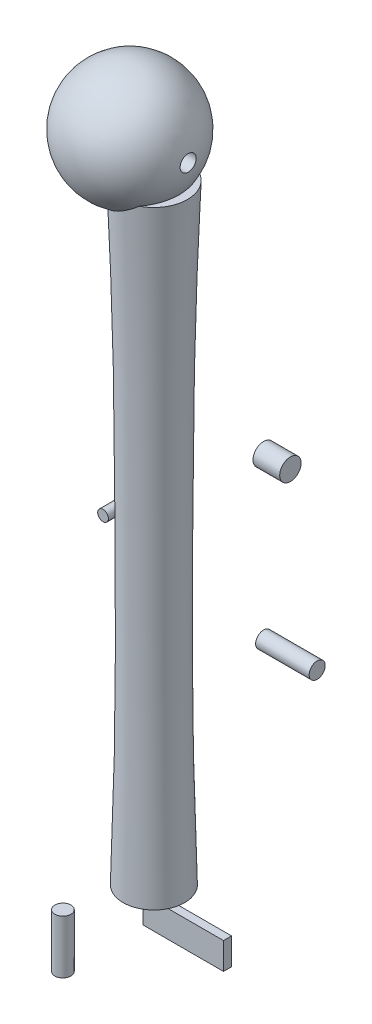
ISO-10303-21;
HEADER;
FILE_DESCRIPTION(('STEP AP214'),'2;1');
FILE_NAME('part.step','',(''),(''),'','','');
FILE_SCHEMA(('AUTOMOTIVE_DESIGN { 1 0 10303 214 1 1 1 1 }'));
ENDSEC;
DATA;
#1=APPLICATION_CONTEXT('core data for automotive mechanical design processes');
#2=APPLICATION_PROTOCOL_DEFINITION('international standard','automotive_design',2000,#1);
#3=PRODUCT_CONTEXT('',#1,'mechanical');
#4=PRODUCT('Part','Part','',(#3));
#5=PRODUCT_RELATED_PRODUCT_CATEGORY('part','',(#4));
#6=PRODUCT_DEFINITION_FORMATION('','',#4);
#7=PRODUCT_DEFINITION_CONTEXT('part definition',#1,'design');
#8=PRODUCT_DEFINITION('design','',#6,#7);
#9=PRODUCT_DEFINITION_SHAPE('','',#8);
#10=(LENGTH_UNIT() NAMED_UNIT(*) SI_UNIT(.MILLI.,.METRE.));
#11=(NAMED_UNIT(*) PLANE_ANGLE_UNIT() SI_UNIT($,.RADIAN.));
#12=(NAMED_UNIT(*) SI_UNIT($,.STERADIAN.) SOLID_ANGLE_UNIT());
#13=UNCERTAINTY_MEASURE_WITH_UNIT(LENGTH_MEASURE(1.E-05),#10,'distance_accuracy_value','');
#14=(GEOMETRIC_REPRESENTATION_CONTEXT(3) GLOBAL_UNCERTAINTY_ASSIGNED_CONTEXT((#13)) GLOBAL_UNIT_ASSIGNED_CONTEXT((#10,
#11,#12)) REPRESENTATION_CONTEXT('',''));
#15=CARTESIAN_POINT('',(0.,0.,0.));
#16=DIRECTION('',(0.,0.,1.));
#17=DIRECTION('',(1.,0.,0.));
#18=AXIS2_PLACEMENT_3D('',#15,#16,#17);
#19=CARTESIAN_POINT('',(-30.,-150.,-20.));
#20=DIRECTION('',(0.,0.,-1.));
#21=DIRECTION('',(-1.,0.,0.));
#22=AXIS2_PLACEMENT_3D('',#19,#20,#21);
#23=PLANE('',#22);
#24=CARTESIAN_POINT('',(-30.,-150.,-20.));
#25=DIRECTION('',(0.,0.,1.));
#26=DIRECTION('',(1.,0.,0.));
#27=AXIS2_PLACEMENT_3D('',#24,#25,#26);
#28=CIRCLE('',#27,2.);
#29=CARTESIAN_POINT('',(-28.,-150.,-20.));
#30=VERTEX_POINT('',#29);
#31=EDGE_CURVE('E11',#30,#30,#28,.T.);
#32=ORIENTED_EDGE('',*,*,#31,.T.);
#33=EDGE_LOOP('',(#32));
#34=FACE_BOUND('',#33,.T.);
#35=ADVANCED_FACE('F40',(#34),#23,.F.);
#36=CARTESIAN_POINT('',(-30.,-150.,-16.));
#37=DIRECTION('',(0.,0.,1.));
#38=DIRECTION('',(1.,0.,0.));
#39=AXIS2_PLACEMENT_3D('',#36,#37,#38);
#40=CYLINDRICAL_SURFACE('',#39,2.);
#41=ORIENTED_EDGE('',*,*,#31,.F.);
#42=EDGE_LOOP('',(#41));
#43=FACE_BOUND('',#42,.T.);
#44=CARTESIAN_POINT('',(-30.,-150.,-35.));
#45=DIRECTION('',(0.,0.,1.));
#46=DIRECTION('',(1.,0.,0.));
#47=AXIS2_PLACEMENT_3D('',#44,#45,#46);
#48=CIRCLE('',#47,2.);
#49=CARTESIAN_POINT('',(-28.,-150.,-35.));
#50=VERTEX_POINT('',#49);
#51=EDGE_CURVE('E46',#50,#50,#48,.T.);
#52=ORIENTED_EDGE('',*,*,#51,.T.);
#53=EDGE_LOOP('',(#52));
#54=FACE_BOUND('',#53,.T.);
#55=ADVANCED_FACE('F52',(#43,#54),#40,.T.);
#56=CARTESIAN_POINT('',(-30.,-148.,-35.));
#57=DIRECTION('',(0.,0.,1.));
#58=DIRECTION('',(1.,0.,0.));
#59=AXIS2_PLACEMENT_3D('',#56,#57,#58);
#60=PLANE('',#59);
#61=ORIENTED_EDGE('',*,*,#51,.F.);
#62=EDGE_LOOP('',(#61));
#63=FACE_BOUND('',#62,.T.);
#64=ADVANCED_FACE('F54',(#63),#60,.F.);
#65=CLOSED_SHELL('',(#35,#55,#64));
#66=MANIFOLD_SOLID_BREP('B2',#65);
#67=CARTESIAN_POINT('',(40.,-150.,-10.));
#68=DIRECTION('',(1.,0.,0.));
#69=DIRECTION('',(0.,0.,-1.));
#70=AXIS2_PLACEMENT_3D('',#67,#68,#69);
#71=PLANE('',#70);
#72=CARTESIAN_POINT('',(40.,-150.,-10.));
#73=DIRECTION('',(-1.,0.,0.));
#74=DIRECTION('',(0.,0.,1.));
#75=AXIS2_PLACEMENT_3D('',#72,#73,#74);
#76=CIRCLE('',#75,3.);
#77=CARTESIAN_POINT('',(40.,-150.,-7.));
#78=VERTEX_POINT('',#77);
#79=EDGE_CURVE('E39',#78,#78,#76,.T.);
#80=ORIENTED_EDGE('',*,*,#79,.T.);
#81=EDGE_LOOP('',(#80));
#82=FACE_BOUND('',#81,.T.);
#83=ADVANCED_FACE('F89',(#82),#71,.F.);
#84=CARTESIAN_POINT('',(36.,-150.,-10.));
#85=DIRECTION('',(-1.,0.,0.));
#86=DIRECTION('',(0.,0.,1.));
#87=AXIS2_PLACEMENT_3D('',#84,#85,#86);
#88=CYLINDRICAL_SURFACE('',#87,3.);
#89=ORIENTED_EDGE('',*,*,#79,.F.);
#90=EDGE_LOOP('',(#89));
#91=FACE_BOUND('',#90,.T.);
#92=CARTESIAN_POINT('',(60.,-150.,-10.));
#93=DIRECTION('',(-1.,0.,0.));
#94=DIRECTION('',(0.,0.,1.));
#95=AXIS2_PLACEMENT_3D('',#92,#93,#94);
#96=CIRCLE('',#95,3.);
#97=CARTESIAN_POINT('',(60.,-150.,-7.));
#98=VERTEX_POINT('',#97);
#99=EDGE_CURVE('E95',#98,#98,#96,.T.);
#100=ORIENTED_EDGE('',*,*,#99,.T.);
#101=EDGE_LOOP('',(#100));
#102=FACE_BOUND('',#101,.T.);
#103=ADVANCED_FACE('F101',(#91,#102),#88,.T.);
#104=CARTESIAN_POINT('',(60.,-147.,-10.));
#105=DIRECTION('',(-1.,0.,0.));
#106=DIRECTION('',(0.,0.,1.));
#107=AXIS2_PLACEMENT_3D('',#104,#105,#106);
#108=PLANE('',#107);
#109=ORIENTED_EDGE('',*,*,#99,.F.);
#110=EDGE_LOOP('',(#109));
#111=FACE_BOUND('',#110,.T.);
#112=ADVANCED_FACE('F103',(#111),#108,.F.);
#113=CLOSED_SHELL('',(#83,#103,#112));
#114=MANIFOLD_SOLID_BREP('B6',#113);
#115=CARTESIAN_POINT('',(-40.,-280.,-15.));
#116=DIRECTION('',(0.,-1.,0.));
#117=DIRECTION('',(0.,0.,-1.));
#118=AXIS2_PLACEMENT_3D('',#115,#116,#117);
#119=CYLINDRICAL_SURFACE('',#118,3.);
#120=CARTESIAN_POINT('',(-40.,-280.,-15.));
#121=DIRECTION('',(0.,1.,0.));
#122=DIRECTION('',(0.,0.,1.));
#123=AXIS2_PLACEMENT_3D('',#120,#121,#122);
#124=CIRCLE('',#123,3.);
#125=CARTESIAN_POINT('',(-40.,-280.,-12.));
#126=VERTEX_POINT('',#125);
#127=EDGE_CURVE('E88',#126,#126,#124,.T.);
#128=ORIENTED_EDGE('',*,*,#127,.F.);
#129=EDGE_LOOP('',(#128));
#130=FACE_BOUND('',#129,.T.);
#131=CARTESIAN_POINT('',(-40.,-300.,-15.));
#132=DIRECTION('',(0.,1.,0.));
#133=DIRECTION('',(0.,0.,1.));
#134=AXIS2_PLACEMENT_3D('',#131,#132,#133);
#135=CIRCLE('',#134,3.);
#136=CARTESIAN_POINT('',(-40.,-300.,-12.));
#137=VERTEX_POINT('',#136);
#138=EDGE_CURVE('E141',#137,#137,#135,.T.);
#139=ORIENTED_EDGE('',*,*,#138,.T.);
#140=EDGE_LOOP('',(#139));
#141=FACE_BOUND('',#140,.T.);
#142=ADVANCED_FACE('F138',(#130,#141),#119,.T.);
#143=CARTESIAN_POINT('',(-40.,-280.,-15.));
#144=DIRECTION('',(0.,1.,0.));
#145=DIRECTION('',(0.,0.,1.));
#146=AXIS2_PLACEMENT_3D('',#143,#144,#145);
#147=PLANE('',#146);
#148=ORIENTED_EDGE('',*,*,#127,.T.);
#149=EDGE_LOOP('',(#148));
#150=FACE_BOUND('',#149,.T.);
#151=ADVANCED_FACE('F153',(#150),#147,.T.);
#152=CARTESIAN_POINT('',(-40.,-300.,-15.));
#153=DIRECTION('',(0.,1.,0.));
#154=DIRECTION('',(0.,0.,1.));
#155=AXIS2_PLACEMENT_3D('',#152,#153,#154);
#156=PLANE('',#155);
#157=ORIENTED_EDGE('',*,*,#138,.F.);
#158=EDGE_LOOP('',(#157));
#159=FACE_BOUND('',#158,.T.);
#160=ADVANCED_FACE('F151',(#159),#156,.F.);
#161=CLOSED_SHELL('',(#142,#151,#160));
#162=MANIFOLD_SOLID_BREP('B34',#161);
#163=CARTESIAN_POINT('',(40.,-100.,-20.));
#164=DIRECTION('',(-1.,0.,0.));
#165=DIRECTION('',(0.,0.,1.));
#166=AXIS2_PLACEMENT_3D('',#163,#164,#165);
#167=CYLINDRICAL_SURFACE('',#166,4.);
#168=CARTESIAN_POINT('',(40.,-100.,-20.));
#169=DIRECTION('',(1.,0.,0.));
#170=DIRECTION('',(0.,0.,-1.));
#171=AXIS2_PLACEMENT_3D('',#168,#169,#170);
#172=CIRCLE('',#171,4.);
#173=CARTESIAN_POINT('',(40.,-100.,-24.));
#174=VERTEX_POINT('',#173);
#175=EDGE_CURVE('E137',#174,#174,#172,.T.);
#176=ORIENTED_EDGE('',*,*,#175,.F.);
#177=EDGE_LOOP('',(#176));
#178=FACE_BOUND('',#177,.T.);
#179=CARTESIAN_POINT('',(30.,-100.,-20.));
#180=DIRECTION('',(1.,0.,0.));
#181=DIRECTION('',(0.,0.,-1.));
#182=AXIS2_PLACEMENT_3D('',#179,#180,#181);
#183=CIRCLE('',#182,4.);
#184=CARTESIAN_POINT('',(30.,-100.,-24.));
#185=VERTEX_POINT('',#184);
#186=EDGE_CURVE('E192',#185,#185,#183,.T.);
#187=ORIENTED_EDGE('',*,*,#186,.T.);
#188=EDGE_LOOP('',(#187));
#189=FACE_BOUND('',#188,.T.);
#190=ADVANCED_FACE('F189',(#178,#189),#167,.T.);
#191=CARTESIAN_POINT('',(40.,-100.,-20.));
#192=DIRECTION('',(1.,0.,0.));
#193=DIRECTION('',(0.,0.,-1.));
#194=AXIS2_PLACEMENT_3D('',#191,#192,#193);
#195=PLANE('',#194);
#196=ORIENTED_EDGE('',*,*,#175,.T.);
#197=EDGE_LOOP('',(#196));
#198=FACE_BOUND('',#197,.T.);
#199=ADVANCED_FACE('F204',(#198),#195,.T.);
#200=CARTESIAN_POINT('',(30.,-100.,-20.));
#201=DIRECTION('',(1.,0.,0.));
#202=DIRECTION('',(0.,0.,-1.));
#203=AXIS2_PLACEMENT_3D('',#200,#201,#202);
#204=PLANE('',#203);
#205=ORIENTED_EDGE('',*,*,#186,.F.);
#206=EDGE_LOOP('',(#205));
#207=FACE_BOUND('',#206,.T.);
#208=ADVANCED_FACE('F202',(#207),#204,.F.);
#209=CLOSED_SHELL('',(#190,#199,#208));
#210=MANIFOLD_SOLID_BREP('B83',#209);
#211=CARTESIAN_POINT('',(0.,-250.,-5.));
#212=DIRECTION('',(1.,0.,0.));
#213=DIRECTION('',(0.,0.,-1.));
#214=AXIS2_PLACEMENT_3D('',#211,#212,#213);
#215=PLANE('',#214);
#216=DIRECTION('',(0.,-1.,0.));
#217=VECTOR('',#216,1.);
#218=CARTESIAN_POINT('',(0.,-250.,-8.));
#219=LINE('',#218,#217);
#220=CARTESIAN_POINT('',(0.,-250.,-8.));
#221=VERTEX_POINT('',#220);
#222=CARTESIAN_POINT('',(0.,-260.,-8.));
#223=VERTEX_POINT('',#222);
#224=EDGE_CURVE('E302',#221,#223,#219,.T.);
#225=ORIENTED_EDGE('',*,*,#224,.T.);
#226=DIRECTION('',(0.,0.,-1.));
#227=VECTOR('',#226,1.);
#228=CARTESIAN_POINT('',(0.,-260.,-5.));
#229=LINE('',#228,#227);
#230=CARTESIAN_POINT('',(0.,-260.,-5.));
#231=VERTEX_POINT('',#230);
#232=EDGE_CURVE('E187',#231,#223,#229,.T.);
#233=ORIENTED_EDGE('',*,*,#232,.F.);
#234=DIRECTION('',(0.,-1.,0.));
#235=VECTOR('',#234,1.);
#236=CARTESIAN_POINT('',(0.,-250.,-5.));
#237=LINE('',#236,#235);
#238=CARTESIAN_POINT('',(0.,-250.,-5.));
#239=VERTEX_POINT('',#238);
#240=EDGE_CURVE('E290',#239,#231,#237,.T.);
#241=ORIENTED_EDGE('',*,*,#240,.F.);
#242=DIRECTION('',(0.,0.,-1.));
#243=VECTOR('',#242,1.);
#244=CARTESIAN_POINT('',(0.,-250.,-5.));
#245=LINE('',#244,#243);
#246=EDGE_CURVE('E298',#239,#221,#245,.T.);
#247=ORIENTED_EDGE('',*,*,#246,.T.);
#248=EDGE_LOOP('',(#225,#233,#241,#247));
#249=FACE_BOUND('',#248,.T.);
#250=ADVANCED_FACE('F239',(#249),#215,.F.);
#251=CARTESIAN_POINT('',(0.,-260.,-5.));
#252=DIRECTION('',(0.,1.,0.));
#253=DIRECTION('',(0.,0.,1.));
#254=AXIS2_PLACEMENT_3D('',#251,#252,#253);
#255=PLANE('',#254);
#256=DIRECTION('',(1.,0.,0.));
#257=VECTOR('',#256,1.);
#258=CARTESIAN_POINT('',(0.,-260.,-8.));
#259=LINE('',#258,#257);
#260=CARTESIAN_POINT('',(30.,-260.,-8.));
#261=VERTEX_POINT('',#260);
#262=EDGE_CURVE('E294',#223,#261,#259,.T.);
#263=ORIENTED_EDGE('',*,*,#262,.T.);
#264=DIRECTION('',(0.,0.,-1.));
#265=VECTOR('',#264,1.);
#266=CARTESIAN_POINT('',(30.,-260.,-5.));
#267=LINE('',#266,#265);
#268=CARTESIAN_POINT('',(30.,-260.,-5.));
#269=VERTEX_POINT('',#268);
#270=EDGE_CURVE('E247',#269,#261,#267,.T.);
#271=ORIENTED_EDGE('',*,*,#270,.F.);
#272=DIRECTION('',(1.,0.,0.));
#273=VECTOR('',#272,1.);
#274=CARTESIAN_POINT('',(0.,-260.,-5.));
#275=LINE('',#274,#273);
#276=EDGE_CURVE('E285',#231,#269,#275,.T.);
#277=ORIENTED_EDGE('',*,*,#276,.F.);
#278=ORIENTED_EDGE('',*,*,#232,.T.);
#279=EDGE_LOOP('',(#263,#271,#277,#278));
#280=FACE_BOUND('',#279,.T.);
#281=ADVANCED_FACE('F293',(#280),#255,.F.);
#282=CARTESIAN_POINT('',(30.,-260.,-5.));
#283=DIRECTION('',(-1.,0.,0.));
#284=DIRECTION('',(0.,0.,1.));
#285=AXIS2_PLACEMENT_3D('',#282,#283,#284);
#286=PLANE('',#285);
#287=DIRECTION('',(0.,1.,0.));
#288=VECTOR('',#287,1.);
#289=CARTESIAN_POINT('',(30.,-260.,-8.));
#290=LINE('',#289,#288);
#291=CARTESIAN_POINT('',(30.,-250.,-8.));
#292=VERTEX_POINT('',#291);
#293=EDGE_CURVE('E272',#261,#292,#290,.T.);
#294=ORIENTED_EDGE('',*,*,#293,.T.);
#295=DIRECTION('',(0.,0.,-1.));
#296=VECTOR('',#295,1.);
#297=CARTESIAN_POINT('',(30.,-250.,-5.));
#298=LINE('',#297,#296);
#299=CARTESIAN_POINT('',(30.,-250.,-5.));
#300=VERTEX_POINT('',#299);
#301=EDGE_CURVE('E295',#300,#292,#298,.T.);
#302=ORIENTED_EDGE('',*,*,#301,.F.);
#303=DIRECTION('',(0.,1.,0.));
#304=VECTOR('',#303,1.);
#305=CARTESIAN_POINT('',(30.,-260.,-5.));
#306=LINE('',#305,#304);
#307=EDGE_CURVE('E288',#269,#300,#306,.T.);
#308=ORIENTED_EDGE('',*,*,#307,.F.);
#309=ORIENTED_EDGE('',*,*,#270,.T.);
#310=EDGE_LOOP('',(#294,#302,#308,#309));
#311=FACE_BOUND('',#310,.T.);
#312=ADVANCED_FACE('F296',(#311),#286,.F.);
#313=CARTESIAN_POINT('',(30.,-250.,-5.));
#314=DIRECTION('',(0.,-1.,0.));
#315=DIRECTION('',(0.,0.,-1.));
#316=AXIS2_PLACEMENT_3D('',#313,#314,#315);
#317=PLANE('',#316);
#318=DIRECTION('',(-1.,0.,0.));
#319=VECTOR('',#318,1.);
#320=CARTESIAN_POINT('',(30.,-250.,-8.));
#321=LINE('',#320,#319);
#322=EDGE_CURVE('E278',#292,#221,#321,.T.);
#323=ORIENTED_EDGE('',*,*,#322,.T.);
#324=ORIENTED_EDGE('',*,*,#246,.F.);
#325=DIRECTION('',(-1.,0.,0.));
#326=VECTOR('',#325,1.);
#327=CARTESIAN_POINT('',(30.,-250.,-5.));
#328=LINE('',#327,#326);
#329=EDGE_CURVE('E255',#300,#239,#328,.T.);
#330=ORIENTED_EDGE('',*,*,#329,.F.);
#331=ORIENTED_EDGE('',*,*,#301,.T.);
#332=EDGE_LOOP('',(#323,#324,#330,#331));
#333=FACE_BOUND('',#332,.T.);
#334=ADVANCED_FACE('F309',(#333),#317,.F.);
#335=CARTESIAN_POINT('',(0.,0.,-5.));
#336=DIRECTION('',(0.,0.,1.));
#337=DIRECTION('',(1.,0.,0.));
#338=AXIS2_PLACEMENT_3D('',#335,#336,#337);
#339=PLANE('',#338);
#340=ORIENTED_EDGE('',*,*,#240,.T.);
#341=ORIENTED_EDGE('',*,*,#276,.T.);
#342=ORIENTED_EDGE('',*,*,#307,.T.);
#343=ORIENTED_EDGE('',*,*,#329,.T.);
#344=EDGE_LOOP('',(#340,#341,#342,#343));
#345=FACE_BOUND('',#344,.T.);
#346=ADVANCED_FACE('F286',(#345),#339,.T.);
#347=CARTESIAN_POINT('',(0.,0.,-8.));
#348=DIRECTION('',(0.,0.,1.));
#349=DIRECTION('',(1.,0.,0.));
#350=AXIS2_PLACEMENT_3D('',#347,#348,#349);
#351=PLANE('',#350);
#352=ORIENTED_EDGE('',*,*,#224,.F.);
#353=ORIENTED_EDGE('',*,*,#322,.F.);
#354=ORIENTED_EDGE('',*,*,#293,.F.);
#355=ORIENTED_EDGE('',*,*,#262,.F.);
#356=EDGE_LOOP('',(#352,#353,#354,#355));
#357=FACE_BOUND('',#356,.T.);
#358=ADVANCED_FACE('F312',(#357),#351,.F.);
#359=CLOSED_SHELL('',(#250,#281,#312,#334,#346,#358));
#360=MANIFOLD_SOLID_BREP('B132',#359);
#361=CARTESIAN_POINT('',(20.5,-240.,0.));
#362=CARTESIAN_POINT('',(20.1173298683155,-226.667368332324,0.));
#363=CARTESIAN_POINT('',(18.9695561391046,-186.677719017289,0.));
#364=CARTESIAN_POINT('',(19.2605238111038,-123.331340782824,0.));
#365=CARTESIAN_POINT('',(19.654971687784,-60.650698391461,0.));
#366=CARTESIAN_POINT('',(21.0196715286873,-24.6655593477582,0.));
#367=CARTESIAN_POINT('',(21.5,-12.,0.));
#368=B_SPLINE_CURVE_WITH_KNOTS('',3,(#361,#362,#363,#364,#365,#366,#367),.UNSPECIFIED.,.F.,.F.,
(4,1,1,1,4),(0.,0.175462041829116,0.52627760938285,0.833265642090846,1.),.UNSPECIFIED.);
#369=CARTESIAN_POINT('',(9.,-244.,0.));
#370=DIRECTION('',(0.,-1.,0.));
#371=AXIS1_PLACEMENT('',#369,#370);
#372=SURFACE_OF_REVOLUTION('',#368,#371);
#373=CARTESIAN_POINT('',(14.7083333333333,-12.,-11.1204734861226));
#374=CARTESIAN_POINT('',(14.4574415231734,-12.1959163464893,-11.2409186671399));
#375=CARTESIAN_POINT('',(14.2017334459514,-12.3905746488891,-11.3534302217671));
#376=CARTESIAN_POINT('',(13.6814228473311,-12.7772374391118,-11.561866631384));
#377=CARTESIAN_POINT('',(13.4168148093923,-12.9692401728566,-11.6577809637382));
#378=CARTESIAN_POINT('',(12.8797094710776,-13.3502429231653,-11.8321662560779));
#379=CARTESIAN_POINT('',(12.6072106482275,-13.5392423492186,-11.910633824138));
#380=CARTESIAN_POINT('',(12.0539353795355,-13.9149014323428,-12.049705675355));
#381=CARTESIAN_POINT('',(11.7731231952646,-14.1015437620649,-12.1102147308118));
#382=CARTESIAN_POINT('',(11.2057262507143,-14.4711536862369,-12.21206802984));
#383=CARTESIAN_POINT('',(10.9191426044536,-14.6541219764957,-12.2534159356305));
#384=CARTESIAN_POINT('',(10.3413758236402,-15.016084030376,-12.3162652116585));
#385=CARTESIAN_POINT('',(10.0501930371891,-15.1950780923569,-12.3377680766832));
#386=CARTESIAN_POINT('',(9.33098180663339,-15.6293866793417,-12.3654029514381));
#387=CARTESIAN_POINT('',(8.90101933880202,-15.8823379150253,-12.3600763382271));
#388=CARTESIAN_POINT('',(8.03816724819805,-16.3781132532911,-12.3042146151346));
#389=CARTESIAN_POINT('',(7.60527746756101,-16.6209368045625,-12.2536770475018));
#390=CARTESIAN_POINT('',(6.74220817153355,-17.094765904898,-12.1061474195897));
#391=CARTESIAN_POINT('',(6.31202471181512,-17.3257973613281,-12.0092625177873));
#392=CARTESIAN_POINT('',(5.45846868285135,-17.7753674034479,-11.7681157532331));
#393=CARTESIAN_POINT('',(5.03509496515989,-17.9939081118876,-11.6238619688987));
#394=CARTESIAN_POINT('',(4.24934174293457,-18.3924531049623,-11.3072371655675));
#395=CARTESIAN_POINT('',(3.88561303454682,-18.5739773382481,-11.140116805056));
#396=CARTESIAN_POINT('',(3.17169387634422,-18.9252849626506,-10.7687797011455));
#397=CARTESIAN_POINT('',(2.82150111775484,-19.0950703599464,-10.5645693182137));
#398=CARTESIAN_POINT('',(2.13880763121924,-19.4218952713185,-10.1196927105069));
#399=CARTESIAN_POINT('',(1.80630452043686,-19.5789365035681,-9.87903141264028));
#400=CARTESIAN_POINT('',(1.16322148297296,-19.879259335663,-9.36240035520624));
#401=CARTESIAN_POINT('',(0.852638550631046,-20.0225428229237,-9.08643545106598));
#402=CARTESIAN_POINT('',(0.294194536410288,-20.2776399192695,-8.53692738298779));
#403=CARTESIAN_POINT('',(0.0433120177777509,-20.391158085364,-8.2672351039815));
#404=CARTESIAN_POINT('',(-0.435436108355907,-20.606126655597,-7.70364097261513));
#405=CARTESIAN_POINT('',(-0.663305558233626,-20.7075790747968,-7.40974317665526));
#406=CARTESIAN_POINT('',(-0.985658672336147,-20.8501538052853,-6.9524550180292));
#407=CARTESIAN_POINT('',(-1.08985690369897,-20.8960732941556,-6.79730434502545));
#408=CARTESIAN_POINT('',(-1.29146692414697,-20.9846428326343,-6.48181134603004));
#409=CARTESIAN_POINT('',(-1.3888804668261,-21.0272937273429,-6.32147037735132));
#410=CARTESIAN_POINT('',(-1.67050283878439,-21.1502440325866,-5.83304977912888));
#411=CARTESIAN_POINT('',(-1.84414513619771,-21.2255638800775,-5.49749923530336));
#412=CARTESIAN_POINT('',(-2.14488962817337,-21.3554359889428,-4.84404397782741));
#413=CARTESIAN_POINT('',(-2.27491048874347,-21.4113123314073,-4.52773471280381));
#414=CARTESIAN_POINT('',(-2.5086802897559,-21.5114553968498,-3.88376157610635));
#415=CARTESIAN_POINT('',(-2.61243118942877,-21.5557229856248,-3.55609855327636));
#416=CARTESIAN_POINT('',(-2.79241891893625,-21.6323413770551,-2.89205559446943));
#417=CARTESIAN_POINT('',(-2.86866458285356,-21.6646960059626,-2.55567849453358));
#418=CARTESIAN_POINT('',(-2.9927815517081,-21.7172890638861,-1.87679492615446));
#419=CARTESIAN_POINT('',(-3.04065381402598,-21.7375279017156,-1.5342886649243));
#420=CARTESIAN_POINT('',(-3.10540674964108,-21.764887605814,-0.86700873895608));
#421=CARTESIAN_POINT('',(-3.12400186771921,-21.7727342447524,-0.542429853587178));
#422=CARTESIAN_POINT('',(-3.13547486155499,-21.7775765749903,0.107253357207904));
#423=CARTESIAN_POINT('',(-3.12835401492035,-21.7745728053543,0.432357655728672));
#424=CARTESIAN_POINT('',(-3.08847611042242,-21.7577348074086,1.08065824022722));
#425=CARTESIAN_POINT('',(-3.05572268353563,-21.7439021130672,1.40385478991391));
#426=CARTESIAN_POINT('',(-2.96493553162347,-21.705493359029,2.04603039243574));
#427=CARTESIAN_POINT('',(-2.90690172251894,-21.680917263601,2.36500943124038));
#428=CARTESIAN_POINT('',(-2.76728394727796,-21.6216441218432,2.99146521915663));
#429=CARTESIAN_POINT('',(-2.68608684488275,-21.5871132435087,3.2990440903768));
#430=CARTESIAN_POINT('',(-2.50062353126604,-21.5079894548758,3.90582640760311));
#431=CARTESIAN_POINT('',(-2.39635773758491,-21.4633967266953,4.20503000509024));
#432=CARTESIAN_POINT('',(-2.1657782453019,-21.36439590347,4.79314168149989));
#433=CARTESIAN_POINT('',(-2.03946390201019,-21.3099875214182,5.08204945907968));
#434=CARTESIAN_POINT('',(-1.76599288388858,-21.1916473853053,5.64779345257203));
#435=CARTESIAN_POINT('',(-1.61883571172039,-21.1277154039963,5.9246293802276));
#436=CARTESIAN_POINT('',(-1.30072970407184,-20.9887760670973,6.47203793594769));
#437=CARTESIAN_POINT('',(-1.12923929334638,-20.9135131651629,6.74223088953882));
#438=CARTESIAN_POINT('',(-0.767286696580018,-20.7536675259552,7.26666779759721));
#439=CARTESIAN_POINT('',(-0.576824289941926,-20.6690846803129,7.52091156655903));
#440=CARTESIAN_POINT('',(-0.178601203808345,-20.4909989593904,8.01217721504278));
#441=CARTESIAN_POINT('',(0.0291614084030619,-20.397495087315,8.24919716482843));
#442=CARTESIAN_POINT('',(0.460219887395186,-20.2019943954102,8.70491619166791));
#443=CARTESIAN_POINT('',(0.683517110564743,-20.0999968338092,8.92361366522919));
#444=CARTESIAN_POINT('',(1.15853200881231,-19.8811785668071,9.35514194219148));
#445=CARTESIAN_POINT('',(1.4111539914909,-19.7638273383462,9.56670860351184));
#446=CARTESIAN_POINT('',(1.92976706170449,-19.5205320670648,9.96729642941832));
#447=CARTESIAN_POINT('',(2.19575862820386,-19.3945877163385,10.1563167854653));
#448=CARTESIAN_POINT('',(2.73901675970924,-19.1345994670599,10.511284112108));
#449=CARTESIAN_POINT('',(3.01628563461063,-19.0005539064024,10.6772263246063));
#450=CARTESIAN_POINT('',(3.57995877833222,-18.7248886749431,10.9856576407576));
#451=CARTESIAN_POINT('',(3.86636377712145,-18.5832683983128,11.1281448647443));
#452=CARTESIAN_POINT('',(4.47262769116877,-18.2797518991452,11.4013904694504));
#453=CARTESIAN_POINT('',(4.79316140783248,-18.1171826715788,11.5299060621924));
#454=CARTESIAN_POINT('',(5.44013085259615,-17.7842379192758,11.75888371048));
#455=CARTESIAN_POINT('',(5.76656691335192,-17.6138619537164,11.85934417956));
#456=CARTESIAN_POINT('',(6.42301409236894,-17.2658487215583,12.0324932994064));
#457=CARTESIAN_POINT('',(6.75302613116054,-17.0882095509751,12.1051746157742));
#458=CARTESIAN_POINT('',(7.41428368582113,-16.7262631055854,12.2231786272574));
#459=CARTESIAN_POINT('',(7.74552928857852,-16.5419553527788,12.2684993570481));
#460=CARTESIAN_POINT('',(8.44263546733648,-16.147082848085,12.3358046245974));
#461=CARTESIAN_POINT('',(8.80839604254712,-15.9358228767764,12.3547629806109));
#462=CARTESIAN_POINT('',(9.5361517870391,-15.5064339721121,12.3608606042201));
#463=CARTESIAN_POINT('',(9.89814647271825,-15.2883041706954,12.3479958346405));
#464=CARTESIAN_POINT('',(10.6159395713166,-14.8457774414236,12.2915942425093));
#465=CARTESIAN_POINT('',(10.9717368504928,-14.6213793860144,12.2480518670008));
#466=CARTESIAN_POINT('',(11.6746993363998,-14.1670134599409,12.1315987737083));
#467=CARTESIAN_POINT('',(12.0218663754623,-13.937046792404,12.058694347465));
#468=CARTESIAN_POINT('',(12.7722407689999,-13.4267072301499,11.8679421351549));
#469=CARTESIAN_POINT('',(13.1732030238395,-13.1452357184788,11.7441084422768));
#470=CARTESIAN_POINT('',(13.7602934293313,-12.7187093761285,11.5304904158677));
#471=CARTESIAN_POINT('',(13.9533727357093,-12.575989645649,11.4547484201988));
#472=CARTESIAN_POINT('',(14.3346114808242,-12.2890826552434,11.2942763598476));
#473=CARTESIAN_POINT('',(14.5227714118239,-12.144895544174,11.2095471988002));
#474=CARTESIAN_POINT('',(14.7083333333333,-12.,11.1204734861226));
#475=B_SPLINE_CURVE_WITH_KNOTS('',3,(#373,#374,#375,#376,#377,#378,#379,#380,#381,#382,#383,
#384,#385,#386,#387,#388,#389,#390,#391,#392,#393,#394,#395,#396,#397,#398,#399,#400,#401,#402,
#403,#404,#405,#406,#407,#408,#409,#410,#411,#412,#413,#414,#415,#416,#417,#418,#419,#420,#421,
#422,#423,#424,#425,#426,#427,#428,#429,#430,#431,#432,#433,#434,#435,#436,#437,#438,#439,#440,
#441,#442,#443,#444,#445,#446,#447,#448,#449,#450,#451,#452,#453,#454,#455,#456,#457,#458,#459,
#460,#461,#462,#463,#464,#465,#466,#467,#468,#469,#470,#471,#472,#473,#474),.UNSPECIFIED.,.F.,
.F.,(4,2,2,2,2,2,2,2,2,2,2,2,2,2,2,2,2,2,2,2,2,2,2,2,2,2,2,2,2,2,2,2,2,2,2,2,2,2,2,2,2,2,2,2,2,
2,2,2,2,2,4),(0.,1.02094431296096,2.04253355157156,3.06432122986852,4.09143406583389,
5.11835051143505,6.14518960034396,7.63962989302831,9.13415143119185,10.6252341036876,
12.1160626148646,13.4327956223764,14.7493030397577,16.0656326692143,17.3817814535415,
18.5365738658468,19.6911731483846,20.2683388555536,20.8453548286066,21.9991103876309,
23.037384882333,24.075581919033,25.1134452119556,26.1512734831058,27.1257079528818,
28.1000940119568,29.074342069606,30.0485933674988,31.0074406066171,31.9662704921418,
32.9251284181255,33.884009227621,34.8691733338607,35.8543488964494,36.8396346673027,
37.8250065756212,38.8732351036028,39.9215012110975,40.9699831237097,42.0185490200624,
43.1624098075616,44.3063352651961,45.4505625397854,46.5948719950211,47.8619803093138,
49.1292493809332,50.3967479000208,51.6639749707835,53.1778624429877,53.9329781737993,
54.6880180516304),.UNSPECIFIED.);
#476=CARTESIAN_POINT('',(14.7083333333333,-12.,-11.1204734861226));
#477=VERTEX_POINT('',#476);
#478=CARTESIAN_POINT('',(14.7083333333333,-12.,11.1204734861226));
#479=VERTEX_POINT('',#478);
#480=EDGE_CURVE('E385',#477,#479,#475,.T.);
#481=ORIENTED_EDGE('',*,*,#480,.F.);
#482=CARTESIAN_POINT('',(9.,-12.,0.));
#483=DIRECTION('',(0.,-1.,0.));
#484=DIRECTION('',(0.,0.,-1.));
#485=AXIS2_PLACEMENT_3D('',#482,#483,#484);
#486=CIRCLE('',#485,12.5);
#487=EDGE_CURVE('E380',#477,#479,#486,.T.);
#488=ORIENTED_EDGE('',*,*,#487,.T.);
#489=EDGE_LOOP('',(#481,#488));
#490=FACE_BOUND('',#489,.T.);
#491=CARTESIAN_POINT('',(9.,-240.,0.));
#492=DIRECTION('',(0.,-1.,0.));
#493=DIRECTION('',(0.,0.,-1.));
#494=AXIS2_PLACEMENT_3D('',#491,#492,#493);
#495=CIRCLE('',#494,11.5);
#496=CARTESIAN_POINT('',(9.,-240.,-11.5));
#497=VERTEX_POINT('',#496);
#498=EDGE_CURVE('E373',#497,#497,#495,.T.);
#499=ORIENTED_EDGE('',*,*,#498,.F.);
#500=EDGE_LOOP('',(#499));
#501=FACE_BOUND('',#500,.T.);
#502=ADVANCED_FACE('F363',(#490,#501),#372,.F.);
#503=CARTESIAN_POINT('',(20.5,-240.,0.));
#504=DIRECTION('',(0.,-1.,0.));
#505=DIRECTION('',(0.,0.,-1.));
#506=AXIS2_PLACEMENT_3D('',#503,#504,#505);
#507=PLANE('',#506);
#508=ORIENTED_EDGE('',*,*,#498,.T.);
#509=EDGE_LOOP('',(#508));
#510=FACE_BOUND('',#509,.T.);
#511=ADVANCED_FACE('F401',(#510),#507,.T.);
#512=CARTESIAN_POINT('',(9.,-12.,0.));
#513=DIRECTION('',(0.,1.,0.));
#514=DIRECTION('',(0.,0.,1.));
#515=AXIS2_PLACEMENT_3D('',#512,#513,#514);
#516=PLANE('',#515);
#517=CARTESIAN_POINT('',(0.,-12.,0.));
#518=DIRECTION('',(0.,1.,0.));
#519=DIRECTION('',(0.,0.,1.));
#520=AXIS2_PLACEMENT_3D('',#517,#518,#519);
#521=CIRCLE('',#520,18.4390889145858);
#522=EDGE_CURVE('E237',#479,#477,#521,.T.);
#523=ORIENTED_EDGE('',*,*,#522,.F.);
#524=ORIENTED_EDGE('',*,*,#487,.F.);
#525=EDGE_LOOP('',(#523,#524));
#526=FACE_BOUND('',#525,.T.);
#527=ADVANCED_FACE('F382',(#526),#516,.T.);
#528=CARTESIAN_POINT('',(0.,0.,0.));
#529=DIRECTION('',(0.,-1.,0.));
#530=DIRECTION('',(1.,0.,0.));
#531=AXIS2_PLACEMENT_3D('',#528,#529,#530);
#532=SPHERICAL_SURFACE('',#531,22.);
#533=CARTESIAN_POINT('',(21.7944947177034,0.,0.));
#534=DIRECTION('',(-1.,0.,0.));
#535=DIRECTION('',(0.,0.,1.));
#536=AXIS2_PLACEMENT_3D('',#533,#534,#535);
#537=CIRCLE('',#536,3.);
#538=CARTESIAN_POINT('',(21.7944947177034,0.,3.));
#539=VERTEX_POINT('',#538);
#540=EDGE_CURVE('E368',#539,#539,#537,.F.);
#541=ORIENTED_EDGE('',*,*,#540,.F.);
#542=EDGE_LOOP('',(#541));
#543=FACE_BOUND('',#542,.T.);
#544=CARTESIAN_POINT('',(-21.7944947177034,0.,0.));
#545=DIRECTION('',(1.,0.,0.));
#546=DIRECTION('',(0.,0.,-1.));
#547=AXIS2_PLACEMENT_3D('',#544,#545,#546);
#548=CIRCLE('',#547,3.);
#549=CARTESIAN_POINT('',(-21.7944947177034,0.,-3.));
#550=VERTEX_POINT('',#549);
#551=EDGE_CURVE('E416',#550,#550,#548,.F.);
#552=ORIENTED_EDGE('',*,*,#551,.F.);
#553=EDGE_LOOP('',(#552));
#554=FACE_BOUND('',#553,.T.);
#555=ORIENTED_EDGE('',*,*,#522,.T.);
#556=ORIENTED_EDGE('',*,*,#480,.T.);
#557=EDGE_LOOP('',(#555,#556));
#558=FACE_BOUND('',#557,.T.);
#559=ADVANCED_FACE('F390',(#543,#554,#558),#532,.T.);
#560=CARTESIAN_POINT('',(-1000.,0.,0.));
#561=DIRECTION('',(1.,0.,0.));
#562=DIRECTION('',(0.,0.,-1.));
#563=AXIS2_PLACEMENT_3D('',#560,#561,#562);
#564=CYLINDRICAL_SURFACE('',#563,3.);
#565=ORIENTED_EDGE('',*,*,#540,.T.);
#566=EDGE_LOOP('',(#565));
#567=FACE_BOUND('',#566,.T.);
#568=ORIENTED_EDGE('',*,*,#551,.T.);
#569=EDGE_LOOP('',(#568));
#570=FACE_BOUND('',#569,.T.);
#571=ADVANCED_FACE('F392',(#567,#570),#564,.F.);
#572=CLOSED_SHELL('',(#502,#511,#527,#559,#571));
#573=MANIFOLD_SOLID_BREP('B181',#572);
#574=ADVANCED_BREP_SHAPE_REPRESENTATION('',(#18,#66,#114,#162,#210,#360,#573),#14);
#575=SHAPE_DEFINITION_REPRESENTATION(#9,#574);
ENDSEC;
END-ISO-10303-21;
